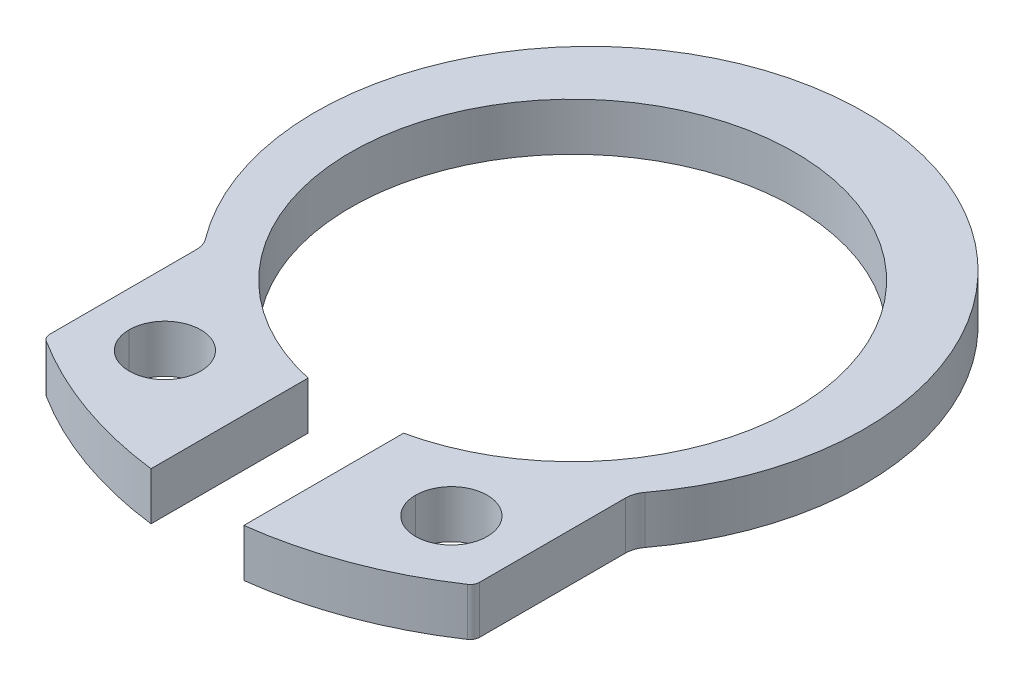
ISO-10303-21;
HEADER;
FILE_DESCRIPTION(('STEP AP214'),'2;1');
FILE_NAME('part.step','',(''),(''),'','','');
FILE_SCHEMA(('AUTOMOTIVE_DESIGN { 1 0 10303 214 1 1 1 1 }'));
ENDSEC;
DATA;
#1=APPLICATION_CONTEXT('core data for automotive mechanical design processes');
#2=APPLICATION_PROTOCOL_DEFINITION('international standard','automotive_design',2000,#1);
#3=PRODUCT_CONTEXT('',#1,'mechanical');
#4=PRODUCT('Part','Part','',(#3));
#5=PRODUCT_RELATED_PRODUCT_CATEGORY('part','',(#4));
#6=PRODUCT_DEFINITION_FORMATION('','',#4);
#7=PRODUCT_DEFINITION_CONTEXT('part definition',#1,'design');
#8=PRODUCT_DEFINITION('design','',#6,#7);
#9=PRODUCT_DEFINITION_SHAPE('','',#8);
#10=(LENGTH_UNIT() NAMED_UNIT(*) SI_UNIT(.MILLI.,.METRE.));
#11=(NAMED_UNIT(*) PLANE_ANGLE_UNIT() SI_UNIT($,.RADIAN.));
#12=(NAMED_UNIT(*) SI_UNIT($,.STERADIAN.) SOLID_ANGLE_UNIT());
#13=UNCERTAINTY_MEASURE_WITH_UNIT(LENGTH_MEASURE(1.E-05),#10,'distance_accuracy_value','');
#14=(GEOMETRIC_REPRESENTATION_CONTEXT(3) GLOBAL_UNCERTAINTY_ASSIGNED_CONTEXT((#13)) GLOBAL_UNIT_ASSIGNED_CONTEXT((#10,
#11,#12)) REPRESENTATION_CONTEXT('',''));
#15=CARTESIAN_POINT('',(0.,0.,0.));
#16=DIRECTION('',(0.,0.,1.));
#17=DIRECTION('',(1.,0.,0.));
#18=AXIS2_PLACEMENT_3D('',#15,#16,#17);
#19=CARTESIAN_POINT('',(1.,0.,4.541200281864));
#20=DIRECTION('',(-1.,0.,0.));
#21=DIRECTION('',(0.,0.,1.));
#22=AXIS2_PLACEMENT_3D('',#19,#20,#21);
#23=PLANE('',#22);
#24=DIRECTION('',(0.,1.,0.));
#25=VECTOR('',#24,1.);
#26=CARTESIAN_POINT('',(1.,0.,7.886856154387));
#27=LINE('',#26,#25);
#28=CARTESIAN_POINT('',(1.,0.,7.886856154387));
#29=VERTEX_POINT('',#28);
#30=CARTESIAN_POINT('',(1.,1.,7.886856154387));
#31=VERTEX_POINT('',#30);
#32=EDGE_CURVE('E11',#29,#31,#27,.T.);
#33=ORIENTED_EDGE('',*,*,#32,.T.);
#34=DIRECTION('',(0.,0.,1.));
#35=VECTOR('',#34,1.);
#36=CARTESIAN_POINT('',(1.,1.,4.541200281864));
#37=LINE('',#36,#35);
#38=CARTESIAN_POINT('',(1.,1.,4.541200281864));
#39=VERTEX_POINT('',#38);
#40=EDGE_CURVE('E281',#39,#31,#37,.T.);
#41=ORIENTED_EDGE('',*,*,#40,.F.);
#42=DIRECTION('',(0.,1.,0.));
#43=VECTOR('',#42,1.);
#44=CARTESIAN_POINT('',(1.,0.,4.541200281864));
#45=LINE('',#44,#43);
#46=CARTESIAN_POINT('',(1.,0.,4.541200281864));
#47=VERTEX_POINT('',#46);
#48=EDGE_CURVE('E165',#47,#39,#45,.T.);
#49=ORIENTED_EDGE('',*,*,#48,.F.);
#50=DIRECTION('',(0.,0.,1.));
#51=VECTOR('',#50,1.);
#52=CARTESIAN_POINT('',(1.,0.,4.541200281864));
#53=LINE('',#52,#51);
#54=EDGE_CURVE('E250',#47,#29,#53,.T.);
#55=ORIENTED_EDGE('',*,*,#54,.T.);
#56=EDGE_LOOP('',(#33,#41,#49,#55));
#57=FACE_BOUND('',#56,.T.);
#58=ADVANCED_FACE('F17',(#57),#23,.T.);
#59=CARTESIAN_POINT('',(0.,0.,0.));
#60=DIRECTION('',(0.,1.,0.));
#61=DIRECTION('',(1.,0.,0.));
#62=AXIS2_PLACEMENT_3D('',#59,#60,#61);
#63=CYLINDRICAL_SURFACE('',#62,7.95);
#64=DIRECTION('',(0.,1.,0.));
#65=VECTOR('',#64,1.);
#66=CARTESIAN_POINT('',(4.410967741935,0.,6.614065586279));
#67=LINE('',#66,#65);
#68=CARTESIAN_POINT('',(4.410967741935,0.,6.614065586279));
#69=VERTEX_POINT('',#68);
#70=CARTESIAN_POINT('',(4.410967741935,1.,6.614065586279));
#71=VERTEX_POINT('',#70);
#72=EDGE_CURVE('E28',#69,#71,#67,.T.);
#73=ORIENTED_EDGE('',*,*,#72,.T.);
#74=CARTESIAN_POINT('',(0.,1.,0.));
#75=DIRECTION('',(0.,1.,0.));
#76=DIRECTION('',(0.125786163521997,0.,0.992057377910379));
#77=AXIS2_PLACEMENT_3D('',#74,#75,#76);
#78=CIRCLE('',#77,7.95);
#79=EDGE_CURVE('E242',#31,#71,#78,.T.);
#80=ORIENTED_EDGE('',*,*,#79,.F.);
#81=ORIENTED_EDGE('',*,*,#32,.F.);
#82=CARTESIAN_POINT('',(0.,0.,0.));
#83=DIRECTION('',(0.,1.,0.));
#84=DIRECTION('',(0.125786163521997,0.,0.992057377910379));
#85=AXIS2_PLACEMENT_3D('',#82,#83,#84);
#86=CIRCLE('',#85,7.95);
#87=EDGE_CURVE('E194',#29,#69,#86,.T.);
#88=ORIENTED_EDGE('',*,*,#87,.T.);
#89=EDGE_LOOP('',(#73,#80,#81,#88));
#90=FACE_BOUND('',#89,.T.);
#91=ADVANCED_FACE('F487',(#90),#63,.T.);
#92=CARTESIAN_POINT('',(4.3,0.,6.447673999203));
#93=DIRECTION('',(0.,1.,0.));
#94=DIRECTION('',(1.,0.,0.));
#95=AXIS2_PLACEMENT_3D('',#92,#93,#94);
#96=CYLINDRICAL_SURFACE('',#95,0.2);
#97=DIRECTION('',(0.,1.,0.));
#98=VECTOR('',#97,1.);
#99=CARTESIAN_POINT('',(4.5,0.,6.447673999203));
#100=LINE('',#99,#98);
#101=CARTESIAN_POINT('',(4.5,0.,6.447673999203));
#102=VERTEX_POINT('',#101);
#103=CARTESIAN_POINT('',(4.5,1.,6.447673999203));
#104=VERTEX_POINT('',#103);
#105=EDGE_CURVE('E173',#102,#104,#100,.T.);
#106=ORIENTED_EDGE('',*,*,#105,.T.);
#107=CARTESIAN_POINT('',(4.3,1.,6.447673999203));
#108=DIRECTION('',(0.,1.,0.));
#109=DIRECTION('',(0.554838709677428,0.,0.831957935381042));
#110=AXIS2_PLACEMENT_3D('',#107,#108,#109);
#111=CIRCLE('',#110,0.2);
#112=EDGE_CURVE('E239',#71,#104,#111,.T.);
#113=ORIENTED_EDGE('',*,*,#112,.F.);
#114=ORIENTED_EDGE('',*,*,#72,.F.);
#115=CARTESIAN_POINT('',(4.3,0.,6.447673999203));
#116=DIRECTION('',(0.,1.,0.));
#117=DIRECTION('',(0.554838709677428,0.,0.831957935381042));
#118=AXIS2_PLACEMENT_3D('',#115,#116,#117);
#119=CIRCLE('',#118,0.2);
#120=EDGE_CURVE('E187',#69,#102,#119,.T.);
#121=ORIENTED_EDGE('',*,*,#120,.T.);
#122=EDGE_LOOP('',(#106,#113,#114,#121));
#123=FACE_BOUND('',#122,.T.);
#124=ADVANCED_FACE('F188',(#123),#96,.T.);
#125=CARTESIAN_POINT('',(4.5,0.,6.447673999203));
#126=DIRECTION('',(1.,0.,0.));
#127=DIRECTION('',(0.,1.,0.));
#128=AXIS2_PLACEMENT_3D('',#125,#126,#127);
#129=PLANE('',#128);
#130=DIRECTION('',(0.,1.,0.));
#131=VECTOR('',#130,1.);
#132=CARTESIAN_POINT('',(4.5,0.,3.39));
#133=LINE('',#132,#131);
#134=CARTESIAN_POINT('',(4.5,0.,3.39));
#135=VERTEX_POINT('',#134);
#136=CARTESIAN_POINT('',(4.5,1.,3.39));
#137=VERTEX_POINT('',#136);
#138=EDGE_CURVE('E184',#135,#137,#133,.T.);
#139=ORIENTED_EDGE('',*,*,#138,.T.);
#140=DIRECTION('',(0.,0.,-1.));
#141=VECTOR('',#140,1.);
#142=CARTESIAN_POINT('',(4.5,1.,6.447673999203));
#143=LINE('',#142,#141);
#144=EDGE_CURVE('E179',#104,#137,#143,.T.);
#145=ORIENTED_EDGE('',*,*,#144,.F.);
#146=ORIENTED_EDGE('',*,*,#105,.F.);
#147=DIRECTION('',(0.,0.,-1.));
#148=VECTOR('',#147,1.);
#149=CARTESIAN_POINT('',(4.5,0.,6.447673999203));
#150=LINE('',#149,#148);
#151=EDGE_CURVE('E21',#102,#135,#150,.T.);
#152=ORIENTED_EDGE('',*,*,#151,.T.);
#153=EDGE_LOOP('',(#139,#145,#146,#152));
#154=FACE_BOUND('',#153,.T.);
#155=ADVANCED_FACE('F175',(#154),#129,.T.);
#156=CARTESIAN_POINT('',(5.,0.,3.39));
#157=DIRECTION('',(0.,1.,0.));
#158=DIRECTION('',(1.,0.,0.));
#159=AXIS2_PLACEMENT_3D('',#156,#157,#158);
#160=CYLINDRICAL_SURFACE('',#159,0.5);
#161=DIRECTION('',(0.,1.,0.));
#162=VECTOR('',#161,1.);
#163=CARTESIAN_POINT('',(4.6,0.,3.09));
#164=LINE('',#163,#162);
#165=CARTESIAN_POINT('',(4.6,0.,3.09));
#166=VERTEX_POINT('',#165);
#167=CARTESIAN_POINT('',(4.6,1.,3.09));
#168=VERTEX_POINT('',#167);
#169=EDGE_CURVE('E234',#166,#168,#164,.T.);
#170=ORIENTED_EDGE('',*,*,#169,.T.);
#171=CARTESIAN_POINT('',(5.,1.,3.39));
#172=DIRECTION('',(0.,-1.,0.));
#173=DIRECTION('',(-1.,0.,0.));
#174=AXIS2_PLACEMENT_3D('',#171,#172,#173);
#175=CIRCLE('',#174,0.5);
#176=EDGE_CURVE('E232',#137,#168,#175,.T.);
#177=ORIENTED_EDGE('',*,*,#176,.F.);
#178=ORIENTED_EDGE('',*,*,#138,.F.);
#179=CARTESIAN_POINT('',(5.,0.,3.39));
#180=DIRECTION('',(0.,-1.,0.));
#181=DIRECTION('',(-1.,0.,0.));
#182=AXIS2_PLACEMENT_3D('',#179,#180,#181);
#183=CIRCLE('',#182,0.5);
#184=EDGE_CURVE('E200',#135,#166,#183,.T.);
#185=ORIENTED_EDGE('',*,*,#184,.T.);
#186=EDGE_LOOP('',(#170,#177,#178,#185));
#187=FACE_BOUND('',#186,.T.);
#188=ADVANCED_FACE('F339',(#187),#160,.F.);
#189=CARTESIAN_POINT('',(0.,0.,-0.36));
#190=DIRECTION('',(0.,1.,0.));
#191=DIRECTION('',(1.,0.,0.));
#192=AXIS2_PLACEMENT_3D('',#189,#190,#191);
#193=CYLINDRICAL_SURFACE('',#192,5.75);
#194=DIRECTION('',(0.,1.,0.));
#195=VECTOR('',#194,1.);
#196=CARTESIAN_POINT('',(-4.6,0.,3.09));
#197=LINE('',#196,#195);
#198=CARTESIAN_POINT('',(-4.6,0.,3.09));
#199=VERTEX_POINT('',#198);
#200=CARTESIAN_POINT('',(-4.6,1.,3.09));
#201=VERTEX_POINT('',#200);
#202=EDGE_CURVE('E292',#199,#201,#197,.T.);
#203=ORIENTED_EDGE('',*,*,#202,.T.);
#204=CARTESIAN_POINT('',(0.,1.,-0.36));
#205=DIRECTION('',(0.,1.,0.));
#206=DIRECTION('',(0.8,0.,0.6));
#207=AXIS2_PLACEMENT_3D('',#204,#205,#206);
#208=CIRCLE('',#207,5.75);
#209=EDGE_CURVE('E227',#168,#201,#208,.T.);
#210=ORIENTED_EDGE('',*,*,#209,.F.);
#211=ORIENTED_EDGE('',*,*,#169,.F.);
#212=CARTESIAN_POINT('',(0.,0.,-0.36));
#213=DIRECTION('',(0.,1.,0.));
#214=DIRECTION('',(0.8,0.,0.6));
#215=AXIS2_PLACEMENT_3D('',#212,#213,#214);
#216=CIRCLE('',#215,5.75);
#217=EDGE_CURVE('E206',#166,#199,#216,.T.);
#218=ORIENTED_EDGE('',*,*,#217,.T.);
#219=EDGE_LOOP('',(#203,#210,#211,#218));
#220=FACE_BOUND('',#219,.T.);
#221=ADVANCED_FACE('F341',(#220),#193,.T.);
#222=CARTESIAN_POINT('',(-5.,0.,3.39));
#223=DIRECTION('',(0.,1.,0.));
#224=DIRECTION('',(1.,0.,0.));
#225=AXIS2_PLACEMENT_3D('',#222,#223,#224);
#226=CYLINDRICAL_SURFACE('',#225,0.5);
#227=DIRECTION('',(0.,1.,0.));
#228=VECTOR('',#227,1.);
#229=CARTESIAN_POINT('',(-4.5,0.,3.39));
#230=LINE('',#229,#228);
#231=CARTESIAN_POINT('',(-4.5,0.,3.39));
#232=VERTEX_POINT('',#231);
#233=CARTESIAN_POINT('',(-4.5,1.,3.39));
#234=VERTEX_POINT('',#233);
#235=EDGE_CURVE('E291',#232,#234,#230,.T.);
#236=ORIENTED_EDGE('',*,*,#235,.T.);
#237=CARTESIAN_POINT('',(-5.,1.,3.39));
#238=DIRECTION('',(0.,-1.,0.));
#239=DIRECTION('',(0.8,0.,-0.6));
#240=AXIS2_PLACEMENT_3D('',#237,#238,#239);
#241=CIRCLE('',#240,0.5);
#242=EDGE_CURVE('E231',#201,#234,#241,.T.);
#243=ORIENTED_EDGE('',*,*,#242,.F.);
#244=ORIENTED_EDGE('',*,*,#202,.F.);
#245=CARTESIAN_POINT('',(-5.,0.,3.39));
#246=DIRECTION('',(0.,-1.,0.));
#247=DIRECTION('',(0.8,0.,-0.6));
#248=AXIS2_PLACEMENT_3D('',#245,#246,#247);
#249=CIRCLE('',#248,0.5);
#250=EDGE_CURVE('E214',#199,#232,#249,.T.);
#251=ORIENTED_EDGE('',*,*,#250,.T.);
#252=EDGE_LOOP('',(#236,#243,#244,#251));
#253=FACE_BOUND('',#252,.T.);
#254=ADVANCED_FACE('F416',(#253),#226,.F.);
#255=CARTESIAN_POINT('',(-4.5,0.,3.39));
#256=DIRECTION('',(-1.,0.,0.));
#257=DIRECTION('',(0.,0.,1.));
#258=AXIS2_PLACEMENT_3D('',#255,#256,#257);
#259=PLANE('',#258);
#260=DIRECTION('',(0.,1.,0.));
#261=VECTOR('',#260,1.);
#262=CARTESIAN_POINT('',(-4.5,0.,6.447673999203));
#263=LINE('',#262,#261);
#264=CARTESIAN_POINT('',(-4.5,0.,6.447673999203));
#265=VERTEX_POINT('',#264);
#266=CARTESIAN_POINT('',(-4.5,1.,6.447673999203));
#267=VERTEX_POINT('',#266);
#268=EDGE_CURVE('E293',#265,#267,#263,.T.);
#269=ORIENTED_EDGE('',*,*,#268,.T.);
#270=DIRECTION('',(0.,0.,1.));
#271=VECTOR('',#270,1.);
#272=CARTESIAN_POINT('',(-4.5,1.,3.39));
#273=LINE('',#272,#271);
#274=EDGE_CURVE('E261',#234,#267,#273,.T.);
#275=ORIENTED_EDGE('',*,*,#274,.F.);
#276=ORIENTED_EDGE('',*,*,#235,.F.);
#277=DIRECTION('',(0.,0.,1.));
#278=VECTOR('',#277,1.);
#279=CARTESIAN_POINT('',(-4.5,0.,3.39));
#280=LINE('',#279,#278);
#281=EDGE_CURVE('E318',#232,#265,#280,.T.);
#282=ORIENTED_EDGE('',*,*,#281,.T.);
#283=EDGE_LOOP('',(#269,#275,#276,#282));
#284=FACE_BOUND('',#283,.T.);
#285=ADVANCED_FACE('F411',(#284),#259,.T.);
#286=CARTESIAN_POINT('',(-4.3,0.,6.447673999203));
#287=DIRECTION('',(0.,1.,0.));
#288=DIRECTION('',(1.,0.,0.));
#289=AXIS2_PLACEMENT_3D('',#286,#287,#288);
#290=CYLINDRICAL_SURFACE('',#289,0.2);
#291=DIRECTION('',(0.,1.,0.));
#292=VECTOR('',#291,1.);
#293=CARTESIAN_POINT('',(-4.40680599212,0.,6.616767109788));
#294=LINE('',#293,#292);
#295=CARTESIAN_POINT('',(-4.40680599212,0.,6.616767109788));
#296=VERTEX_POINT('',#295);
#297=CARTESIAN_POINT('',(-4.40680599212,1.,6.616767109788));
#298=VERTEX_POINT('',#297);
#299=EDGE_CURVE('E302',#296,#298,#294,.T.);
#300=ORIENTED_EDGE('',*,*,#299,.T.);
#301=CARTESIAN_POINT('',(-4.3,1.,6.447673999203));
#302=DIRECTION('',(0.,1.,0.));
#303=DIRECTION('',(-1.,0.,0.));
#304=AXIS2_PLACEMENT_3D('',#301,#302,#303);
#305=CIRCLE('',#304,0.2);
#306=EDGE_CURVE('E256',#267,#298,#305,.T.);
#307=ORIENTED_EDGE('',*,*,#306,.F.);
#308=ORIENTED_EDGE('',*,*,#268,.F.);
#309=CARTESIAN_POINT('',(-4.3,0.,6.447673999203));
#310=DIRECTION('',(0.,1.,0.));
#311=DIRECTION('',(-1.,0.,0.));
#312=AXIS2_PLACEMENT_3D('',#309,#310,#311);
#313=CIRCLE('',#312,0.2);
#314=EDGE_CURVE('E326',#265,#296,#313,.T.);
#315=ORIENTED_EDGE('',*,*,#314,.T.);
#316=EDGE_LOOP('',(#300,#307,#308,#315));
#317=FACE_BOUND('',#316,.T.);
#318=ADVANCED_FACE('F387',(#317),#290,.T.);
#319=CARTESIAN_POINT('',(0.,0.,-0.36));
#320=DIRECTION('',(0.,1.,0.));
#321=DIRECTION('',(1.,0.,0.));
#322=AXIS2_PLACEMENT_3D('',#319,#320,#321);
#323=CYLINDRICAL_SURFACE('',#322,8.251982692445);
#324=DIRECTION('',(0.,1.,0.));
#325=VECTOR('',#324,1.);
#326=CARTESIAN_POINT('',(-1.,0.,7.831167093669));
#327=LINE('',#326,#325);
#328=CARTESIAN_POINT('',(-1.,0.,7.831167093669));
#329=VERTEX_POINT('',#328);
#330=CARTESIAN_POINT('',(-1.,1.,7.831167093669));
#331=VERTEX_POINT('',#330);
#332=EDGE_CURVE('E277',#329,#331,#327,.T.);
#333=ORIENTED_EDGE('',*,*,#332,.T.);
#334=CARTESIAN_POINT('',(0.,1.,-0.36));
#335=DIRECTION('',(0.,1.,0.));
#336=DIRECTION('',(-0.534029960600225,0.,0.84546555292414));
#337=AXIS2_PLACEMENT_3D('',#334,#335,#336);
#338=CIRCLE('',#337,8.251982692445);
#339=EDGE_CURVE('E260',#298,#331,#338,.T.);
#340=ORIENTED_EDGE('',*,*,#339,.F.);
#341=ORIENTED_EDGE('',*,*,#299,.F.);
#342=CARTESIAN_POINT('',(0.,0.,-0.36));
#343=DIRECTION('',(0.,1.,0.));
#344=DIRECTION('',(-0.534029960600225,0.,0.84546555292414));
#345=AXIS2_PLACEMENT_3D('',#342,#343,#344);
#346=CIRCLE('',#345,8.251982692445);
#347=EDGE_CURVE('E315',#296,#329,#346,.T.);
#348=ORIENTED_EDGE('',*,*,#347,.T.);
#349=EDGE_LOOP('',(#333,#340,#341,#348));
#350=FACE_BOUND('',#349,.T.);
#351=ADVANCED_FACE('F385',(#350),#323,.T.);
#352=CARTESIAN_POINT('',(-1.,0.,7.831167093669));
#353=DIRECTION('',(1.,0.,0.));
#354=DIRECTION('',(0.,1.,0.));
#355=AXIS2_PLACEMENT_3D('',#352,#353,#354);
#356=PLANE('',#355);
#357=DIRECTION('',(0.,1.,0.));
#358=VECTOR('',#357,1.);
#359=CARTESIAN_POINT('',(-1.,0.,4.541200281864));
#360=LINE('',#359,#358);
#361=CARTESIAN_POINT('',(-1.,0.,4.541200281864));
#362=VERTEX_POINT('',#361);
#363=CARTESIAN_POINT('',(-1.,1.,4.541200281864));
#364=VERTEX_POINT('',#363);
#365=EDGE_CURVE('E238',#362,#364,#360,.T.);
#366=ORIENTED_EDGE('',*,*,#365,.T.);
#367=DIRECTION('',(0.,0.,-1.));
#368=VECTOR('',#367,1.);
#369=CARTESIAN_POINT('',(-1.,1.,7.831167093669));
#370=LINE('',#369,#368);
#371=EDGE_CURVE('E266',#331,#364,#370,.T.);
#372=ORIENTED_EDGE('',*,*,#371,.F.);
#373=ORIENTED_EDGE('',*,*,#332,.F.);
#374=DIRECTION('',(0.,0.,-1.));
#375=VECTOR('',#374,1.);
#376=CARTESIAN_POINT('',(-1.,0.,7.831167093669));
#377=LINE('',#376,#375);
#378=EDGE_CURVE('E218',#329,#362,#377,.T.);
#379=ORIENTED_EDGE('',*,*,#378,.T.);
#380=EDGE_LOOP('',(#366,#372,#373,#379));
#381=FACE_BOUND('',#380,.T.);
#382=ADVANCED_FACE('F376',(#381),#356,.T.);
#383=CARTESIAN_POINT('',(0.,0.,0.));
#384=DIRECTION('',(0.,1.,0.));
#385=DIRECTION('',(1.,0.,0.));
#386=AXIS2_PLACEMENT_3D('',#383,#384,#385);
#387=CYLINDRICAL_SURFACE('',#386,4.65);
#388=ORIENTED_EDGE('',*,*,#48,.T.);
#389=CARTESIAN_POINT('',(0.,1.,0.));
#390=DIRECTION('',(0.,-1.,0.));
#391=DIRECTION('',(-0.2150537634409,0.,0.9766022111535));
#392=AXIS2_PLACEMENT_3D('',#389,#390,#391);
#393=CIRCLE('',#392,4.65);
#394=EDGE_CURVE('E262',#364,#39,#393,.T.);
#395=ORIENTED_EDGE('',*,*,#394,.F.);
#396=ORIENTED_EDGE('',*,*,#365,.F.);
#397=CARTESIAN_POINT('',(0.,0.,0.));
#398=DIRECTION('',(0.,-1.,0.));
#399=DIRECTION('',(-0.2150537634409,0.,0.9766022111535));
#400=AXIS2_PLACEMENT_3D('',#397,#398,#399);
#401=CIRCLE('',#400,4.65);
#402=EDGE_CURVE('E253',#362,#47,#401,.T.);
#403=ORIENTED_EDGE('',*,*,#402,.T.);
#404=EDGE_LOOP('',(#388,#395,#396,#403));
#405=FACE_BOUND('',#404,.T.);
#406=ADVANCED_FACE('F383',(#405),#387,.F.);
#407=CARTESIAN_POINT('',(3.,0.,5.539855593786));
#408=DIRECTION('',(0.,1.,0.));
#409=DIRECTION('',(1.,0.,0.));
#410=AXIS2_PLACEMENT_3D('',#407,#408,#409);
#411=CYLINDRICAL_SURFACE('',#410,0.75);
#412=DIRECTION('',(0.,1.,0.));
#413=VECTOR('',#412,1.);
#414=CARTESIAN_POINT('',(3.75,0.,5.539855593786));
#415=LINE('',#414,#413);
#416=CARTESIAN_POINT('',(3.75,0.,5.539855593786));
#417=VERTEX_POINT('',#416);
#418=CARTESIAN_POINT('',(3.75,1.,5.539855593786));
#419=VERTEX_POINT('',#418);
#420=EDGE_CURVE('E42',#417,#419,#415,.T.);
#421=ORIENTED_EDGE('',*,*,#420,.T.);
#422=CARTESIAN_POINT('',(3.,1.,5.539855593786));
#423=DIRECTION('',(0.,-1.,0.));
#424=DIRECTION('',(-1.,0.,0.));
#425=AXIS2_PLACEMENT_3D('',#422,#423,#424);
#426=CIRCLE('',#425,0.75);
#427=CARTESIAN_POINT('',(2.25,1.,5.539855593786));
#428=VERTEX_POINT('',#427);
#429=EDGE_CURVE('E265',#428,#419,#426,.T.);
#430=ORIENTED_EDGE('',*,*,#429,.F.);
#431=DIRECTION('',(0.,1.,0.));
#432=VECTOR('',#431,1.);
#433=CARTESIAN_POINT('',(2.25,0.,5.539855593786));
#434=LINE('',#433,#432);
#435=CARTESIAN_POINT('',(2.25,0.,5.539855593786));
#436=VERTEX_POINT('',#435);
#437=EDGE_CURVE('E353',#436,#428,#434,.T.);
#438=ORIENTED_EDGE('',*,*,#437,.F.);
#439=CARTESIAN_POINT('',(3.,0.,5.539855593786));
#440=DIRECTION('',(0.,-1.,0.));
#441=DIRECTION('',(-1.,0.,0.));
#442=AXIS2_PLACEMENT_3D('',#439,#440,#441);
#443=CIRCLE('',#442,0.75);
#444=EDGE_CURVE('E223',#436,#417,#443,.T.);
#445=ORIENTED_EDGE('',*,*,#444,.T.);
#446=EDGE_LOOP('',(#421,#430,#438,#445));
#447=FACE_BOUND('',#446,.T.);
#448=ADVANCED_FACE('F449',(#447),#411,.F.);
#449=CARTESIAN_POINT('',(3.,0.,5.539855593786));
#450=DIRECTION('',(0.,1.,0.));
#451=DIRECTION('',(1.,0.,0.));
#452=AXIS2_PLACEMENT_3D('',#449,#450,#451);
#453=CYLINDRICAL_SURFACE('',#452,0.75);
#454=ORIENTED_EDGE('',*,*,#437,.T.);
#455=CARTESIAN_POINT('',(3.,1.,5.539855593786));
#456=DIRECTION('',(0.,-1.,0.));
#457=DIRECTION('',(1.,0.,0.));
#458=AXIS2_PLACEMENT_3D('',#455,#456,#457);
#459=CIRCLE('',#458,0.75);
#460=EDGE_CURVE('E331',#419,#428,#459,.T.);
#461=ORIENTED_EDGE('',*,*,#460,.F.);
#462=ORIENTED_EDGE('',*,*,#420,.F.);
#463=CARTESIAN_POINT('',(3.,0.,5.539855593786));
#464=DIRECTION('',(0.,-1.,0.));
#465=DIRECTION('',(1.,0.,0.));
#466=AXIS2_PLACEMENT_3D('',#463,#464,#465);
#467=CIRCLE('',#466,0.75);
#468=EDGE_CURVE('E220',#417,#436,#467,.T.);
#469=ORIENTED_EDGE('',*,*,#468,.T.);
#470=EDGE_LOOP('',(#454,#461,#462,#469));
#471=FACE_BOUND('',#470,.T.);
#472=ADVANCED_FACE('F454',(#471),#453,.F.);
#473=CARTESIAN_POINT('',(0.,1.,0.));
#474=DIRECTION('',(0.,1.,0.));
#475=DIRECTION('',(1.,0.,0.));
#476=AXIS2_PLACEMENT_3D('',#473,#474,#475);
#477=PLANE('',#476);
#478=ORIENTED_EDGE('',*,*,#429,.T.);
#479=ORIENTED_EDGE('',*,*,#460,.T.);
#480=EDGE_LOOP('',(#478,#479));
#481=FACE_BOUND('',#480,.T.);
#482=CARTESIAN_POINT('',(-3.,1.,5.539855593786));
#483=DIRECTION('',(0.,-1.,0.));
#484=DIRECTION('',(-1.,0.,0.));
#485=AXIS2_PLACEMENT_3D('',#482,#483,#484);
#486=CIRCLE('',#485,0.75);
#487=CARTESIAN_POINT('',(-3.75,1.,5.539855593786));
#488=VERTEX_POINT('',#487);
#489=CARTESIAN_POINT('',(-2.25,1.,5.539855593786));
#490=VERTEX_POINT('',#489);
#491=EDGE_CURVE('E285',#488,#490,#486,.T.);
#492=ORIENTED_EDGE('',*,*,#491,.T.);
#493=CARTESIAN_POINT('',(-3.,1.,5.539855593786));
#494=DIRECTION('',(0.,-1.,0.));
#495=DIRECTION('',(1.,0.,0.));
#496=AXIS2_PLACEMENT_3D('',#493,#494,#495);
#497=CIRCLE('',#496,0.75);
#498=EDGE_CURVE('E243',#490,#488,#497,.T.);
#499=ORIENTED_EDGE('',*,*,#498,.T.);
#500=EDGE_LOOP('',(#492,#499));
#501=FACE_BOUND('',#500,.T.);
#502=ORIENTED_EDGE('',*,*,#40,.T.);
#503=ORIENTED_EDGE('',*,*,#79,.T.);
#504=ORIENTED_EDGE('',*,*,#112,.T.);
#505=ORIENTED_EDGE('',*,*,#144,.T.);
#506=ORIENTED_EDGE('',*,*,#176,.T.);
#507=ORIENTED_EDGE('',*,*,#209,.T.);
#508=ORIENTED_EDGE('',*,*,#242,.T.);
#509=ORIENTED_EDGE('',*,*,#274,.T.);
#510=ORIENTED_EDGE('',*,*,#306,.T.);
#511=ORIENTED_EDGE('',*,*,#339,.T.);
#512=ORIENTED_EDGE('',*,*,#371,.T.);
#513=ORIENTED_EDGE('',*,*,#394,.T.);
#514=EDGE_LOOP('',(#502,#503,#504,#505,#506,#507,#508,#509,#510,#511,#512,#513));
#515=FACE_BOUND('',#514,.T.);
#516=ADVANCED_FACE('F343',(#481,#501,#515),#477,.T.);
#517=CARTESIAN_POINT('',(-3.,0.,5.539855593786));
#518=DIRECTION('',(0.,1.,0.));
#519=DIRECTION('',(1.,0.,0.));
#520=AXIS2_PLACEMENT_3D('',#517,#518,#519);
#521=CYLINDRICAL_SURFACE('',#520,0.75);
#522=DIRECTION('',(0.,1.,0.));
#523=VECTOR('',#522,1.);
#524=CARTESIAN_POINT('',(-2.25,0.,5.539855593786));
#525=LINE('',#524,#523);
#526=CARTESIAN_POINT('',(-2.25,0.,5.539855593786));
#527=VERTEX_POINT('',#526);
#528=EDGE_CURVE('E247',#527,#490,#525,.T.);
#529=ORIENTED_EDGE('',*,*,#528,.T.);
#530=ORIENTED_EDGE('',*,*,#491,.F.);
#531=DIRECTION('',(0.,1.,0.));
#532=VECTOR('',#531,1.);
#533=CARTESIAN_POINT('',(-3.75,0.,5.539855593786));
#534=LINE('',#533,#532);
#535=CARTESIAN_POINT('',(-3.75,0.,5.539855593786));
#536=VERTEX_POINT('',#535);
#537=EDGE_CURVE('E154',#536,#488,#534,.T.);
#538=ORIENTED_EDGE('',*,*,#537,.F.);
#539=CARTESIAN_POINT('',(-3.,0.,5.539855593786));
#540=DIRECTION('',(0.,-1.,0.));
#541=DIRECTION('',(-1.,0.,0.));
#542=AXIS2_PLACEMENT_3D('',#539,#540,#541);
#543=CIRCLE('',#542,0.75);
#544=EDGE_CURVE('E273',#536,#527,#543,.T.);
#545=ORIENTED_EDGE('',*,*,#544,.T.);
#546=EDGE_LOOP('',(#529,#530,#538,#545));
#547=FACE_BOUND('',#546,.T.);
#548=ADVANCED_FACE('F19',(#547),#521,.F.);
#549=CARTESIAN_POINT('',(-3.,0.,5.539855593786));
#550=DIRECTION('',(0.,1.,0.));
#551=DIRECTION('',(1.,0.,0.));
#552=AXIS2_PLACEMENT_3D('',#549,#550,#551);
#553=CYLINDRICAL_SURFACE('',#552,0.75);
#554=ORIENTED_EDGE('',*,*,#537,.T.);
#555=ORIENTED_EDGE('',*,*,#498,.F.);
#556=ORIENTED_EDGE('',*,*,#528,.F.);
#557=CARTESIAN_POINT('',(-3.,0.,5.539855593786));
#558=DIRECTION('',(0.,-1.,0.));
#559=DIRECTION('',(1.,0.,0.));
#560=AXIS2_PLACEMENT_3D('',#557,#558,#559);
#561=CIRCLE('',#560,0.75);
#562=EDGE_CURVE('E226',#527,#536,#561,.T.);
#563=ORIENTED_EDGE('',*,*,#562,.T.);
#564=EDGE_LOOP('',(#554,#555,#556,#563));
#565=FACE_BOUND('',#564,.T.);
#566=ADVANCED_FACE('F396',(#565),#553,.F.);
#567=CARTESIAN_POINT('',(0.,0.,0.));
#568=DIRECTION('',(0.,1.,0.));
#569=DIRECTION('',(1.,0.,0.));
#570=AXIS2_PLACEMENT_3D('',#567,#568,#569);
#571=PLANE('',#570);
#572=ORIENTED_EDGE('',*,*,#444,.F.);
#573=ORIENTED_EDGE('',*,*,#468,.F.);
#574=EDGE_LOOP('',(#572,#573));
#575=FACE_BOUND('',#574,.T.);
#576=ORIENTED_EDGE('',*,*,#544,.F.);
#577=ORIENTED_EDGE('',*,*,#562,.F.);
#578=EDGE_LOOP('',(#576,#577));
#579=FACE_BOUND('',#578,.T.);
#580=ORIENTED_EDGE('',*,*,#378,.F.);
#581=ORIENTED_EDGE('',*,*,#347,.F.);
#582=ORIENTED_EDGE('',*,*,#314,.F.);
#583=ORIENTED_EDGE('',*,*,#281,.F.);
#584=ORIENTED_EDGE('',*,*,#250,.F.);
#585=ORIENTED_EDGE('',*,*,#217,.F.);
#586=ORIENTED_EDGE('',*,*,#184,.F.);
#587=ORIENTED_EDGE('',*,*,#151,.F.);
#588=ORIENTED_EDGE('',*,*,#120,.F.);
#589=ORIENTED_EDGE('',*,*,#87,.F.);
#590=ORIENTED_EDGE('',*,*,#54,.F.);
#591=ORIENTED_EDGE('',*,*,#402,.F.);
#592=EDGE_LOOP('',(#580,#581,#582,#583,#584,#585,#586,#587,#588,#589,#590,#591));
#593=FACE_BOUND('',#592,.T.);
#594=ADVANCED_FACE('F197',(#575,#579,#593),#571,.F.);
#595=CLOSED_SHELL('',(#58,#91,#124,#155,#188,#221,#254,#285,#318,#351,#382,#406,#448,#472,#516,
#548,#566,#594));
#596=MANIFOLD_SOLID_BREP('B1',#595);
#597=ADVANCED_BREP_SHAPE_REPRESENTATION('',(#18,#596),#14);
#598=SHAPE_DEFINITION_REPRESENTATION(#9,#597);
ENDSEC;
END-ISO-10303-21;
